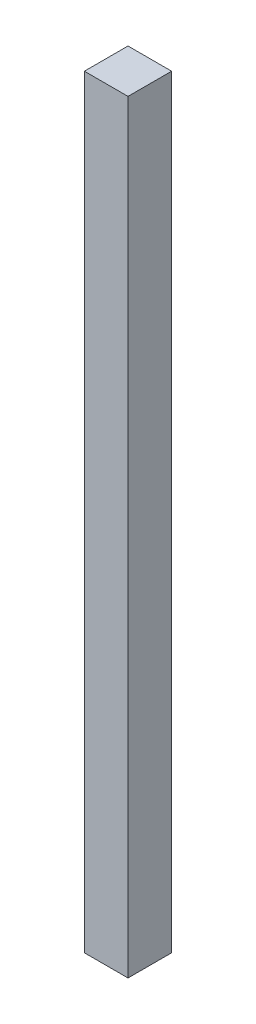
ISO-10303-21;
HEADER;
FILE_DESCRIPTION(('STEP AP214'),'2;1');
FILE_NAME('part.step','',(''),(''),'','','');
FILE_SCHEMA(('AUTOMOTIVE_DESIGN { 1 0 10303 214 1 1 1 1 }'));
ENDSEC;
DATA;
#1=APPLICATION_CONTEXT('core data for automotive mechanical design processes');
#2=APPLICATION_PROTOCOL_DEFINITION('international standard','automotive_design',2000,#1);
#3=PRODUCT_CONTEXT('',#1,'mechanical');
#4=PRODUCT('Part','Part','',(#3));
#5=PRODUCT_RELATED_PRODUCT_CATEGORY('part','',(#4));
#6=PRODUCT_DEFINITION_FORMATION('','',#4);
#7=PRODUCT_DEFINITION_CONTEXT('part definition',#1,'design');
#8=PRODUCT_DEFINITION('design','',#6,#7);
#9=PRODUCT_DEFINITION_SHAPE('','',#8);
#10=(LENGTH_UNIT() NAMED_UNIT(*) SI_UNIT(.MILLI.,.METRE.));
#11=(NAMED_UNIT(*) PLANE_ANGLE_UNIT() SI_UNIT($,.RADIAN.));
#12=(NAMED_UNIT(*) SI_UNIT($,.STERADIAN.) SOLID_ANGLE_UNIT());
#13=UNCERTAINTY_MEASURE_WITH_UNIT(LENGTH_MEASURE(1.E-05),#10,'distance_accuracy_value','');
#14=(GEOMETRIC_REPRESENTATION_CONTEXT(3) GLOBAL_UNCERTAINTY_ASSIGNED_CONTEXT((#13)) GLOBAL_UNIT_ASSIGNED_CONTEXT((#10,
#11,#12)) REPRESENTATION_CONTEXT('',''));
#15=CARTESIAN_POINT('',(0.,0.,0.));
#16=DIRECTION('',(0.,0.,1.));
#17=DIRECTION('',(1.,0.,0.));
#18=AXIS2_PLACEMENT_3D('',#15,#16,#17);
#19=CARTESIAN_POINT('',(0.,350.,0.));
#20=DIRECTION('',(1.,0.,0.));
#21=DIRECTION('',(0.,0.,-1.));
#22=AXIS2_PLACEMENT_3D('',#19,#20,#21);
#23=PLANE('',#22);
#24=DIRECTION('',(0.,0.,1.));
#25=VECTOR('',#24,1.);
#26=CARTESIAN_POINT('',(0.,0.,0.));
#27=LINE('',#26,#25);
#28=CARTESIAN_POINT('',(0.,0.,0.));
#29=VERTEX_POINT('',#28);
#30=CARTESIAN_POINT('',(0.,0.,20.));
#31=VERTEX_POINT('',#30);
#32=EDGE_CURVE('E104',#29,#31,#27,.T.);
#33=ORIENTED_EDGE('',*,*,#32,.T.);
#34=DIRECTION('',(0.,-1.,0.));
#35=VECTOR('',#34,1.);
#36=CARTESIAN_POINT('',(0.,350.,20.));
#37=LINE('',#36,#35);
#38=CARTESIAN_POINT('',(0.,350.,20.));
#39=VERTEX_POINT('',#38);
#40=EDGE_CURVE('E11',#39,#31,#37,.T.);
#41=ORIENTED_EDGE('',*,*,#40,.F.);
#42=DIRECTION('',(0.,0.,1.));
#43=VECTOR('',#42,1.);
#44=CARTESIAN_POINT('',(0.,350.,0.));
#45=LINE('',#44,#43);
#46=CARTESIAN_POINT('',(0.,350.,0.));
#47=VERTEX_POINT('',#46);
#48=EDGE_CURVE('E92',#47,#39,#45,.T.);
#49=ORIENTED_EDGE('',*,*,#48,.F.);
#50=DIRECTION('',(0.,-1.,0.));
#51=VECTOR('',#50,1.);
#52=CARTESIAN_POINT('',(0.,350.,0.));
#53=LINE('',#52,#51);
#54=EDGE_CURVE('E100',#47,#29,#53,.T.);
#55=ORIENTED_EDGE('',*,*,#54,.T.);
#56=EDGE_LOOP('',(#33,#41,#49,#55));
#57=FACE_BOUND('',#56,.T.);
#58=ADVANCED_FACE('F41',(#57),#23,.F.);
#59=CARTESIAN_POINT('',(0.,350.,20.));
#60=DIRECTION('',(0.,0.,-1.));
#61=DIRECTION('',(-1.,0.,0.));
#62=AXIS2_PLACEMENT_3D('',#59,#60,#61);
#63=PLANE('',#62);
#64=DIRECTION('',(1.,0.,0.));
#65=VECTOR('',#64,1.);
#66=CARTESIAN_POINT('',(0.,0.,20.));
#67=LINE('',#66,#65);
#68=CARTESIAN_POINT('',(20.,0.,20.));
#69=VERTEX_POINT('',#68);
#70=EDGE_CURVE('E96',#31,#69,#67,.T.);
#71=ORIENTED_EDGE('',*,*,#70,.T.);
#72=DIRECTION('',(0.,-1.,0.));
#73=VECTOR('',#72,1.);
#74=CARTESIAN_POINT('',(20.,350.,20.));
#75=LINE('',#74,#73);
#76=CARTESIAN_POINT('',(20.,350.,20.));
#77=VERTEX_POINT('',#76);
#78=EDGE_CURVE('E49',#77,#69,#75,.T.);
#79=ORIENTED_EDGE('',*,*,#78,.F.);
#80=DIRECTION('',(1.,0.,0.));
#81=VECTOR('',#80,1.);
#82=CARTESIAN_POINT('',(0.,350.,20.));
#83=LINE('',#82,#81);
#84=EDGE_CURVE('E87',#39,#77,#83,.T.);
#85=ORIENTED_EDGE('',*,*,#84,.F.);
#86=ORIENTED_EDGE('',*,*,#40,.T.);
#87=EDGE_LOOP('',(#71,#79,#85,#86));
#88=FACE_BOUND('',#87,.T.);
#89=ADVANCED_FACE('F95',(#88),#63,.F.);
#90=CARTESIAN_POINT('',(20.,350.,0.));
#91=DIRECTION('',(-1.,0.,0.));
#92=DIRECTION('',(0.,0.,1.));
#93=AXIS2_PLACEMENT_3D('',#90,#91,#92);
#94=PLANE('',#93);
#95=DIRECTION('',(0.,0.,-1.));
#96=VECTOR('',#95,1.);
#97=CARTESIAN_POINT('',(20.,0.,0.));
#98=LINE('',#97,#96);
#99=CARTESIAN_POINT('',(20.,0.,0.));
#100=VERTEX_POINT('',#99);
#101=EDGE_CURVE('E74',#69,#100,#98,.T.);
#102=ORIENTED_EDGE('',*,*,#101,.T.);
#103=DIRECTION('',(0.,-1.,0.));
#104=VECTOR('',#103,1.);
#105=CARTESIAN_POINT('',(20.,350.,0.));
#106=LINE('',#105,#104);
#107=CARTESIAN_POINT('',(20.,350.,0.));
#108=VERTEX_POINT('',#107);
#109=EDGE_CURVE('E97',#108,#100,#106,.T.);
#110=ORIENTED_EDGE('',*,*,#109,.F.);
#111=DIRECTION('',(0.,0.,-1.));
#112=VECTOR('',#111,1.);
#113=CARTESIAN_POINT('',(20.,350.,0.));
#114=LINE('',#113,#112);
#115=EDGE_CURVE('E90',#77,#108,#114,.T.);
#116=ORIENTED_EDGE('',*,*,#115,.F.);
#117=ORIENTED_EDGE('',*,*,#78,.T.);
#118=EDGE_LOOP('',(#102,#110,#116,#117));
#119=FACE_BOUND('',#118,.T.);
#120=ADVANCED_FACE('F98',(#119),#94,.F.);
#121=CARTESIAN_POINT('',(0.,350.,0.));
#122=DIRECTION('',(0.,0.,1.));
#123=DIRECTION('',(1.,0.,0.));
#124=AXIS2_PLACEMENT_3D('',#121,#122,#123);
#125=PLANE('',#124);
#126=DIRECTION('',(-1.,0.,0.));
#127=VECTOR('',#126,1.);
#128=CARTESIAN_POINT('',(0.,0.,0.));
#129=LINE('',#128,#127);
#130=EDGE_CURVE('E80',#100,#29,#129,.T.);
#131=ORIENTED_EDGE('',*,*,#130,.T.);
#132=ORIENTED_EDGE('',*,*,#54,.F.);
#133=DIRECTION('',(-1.,0.,0.));
#134=VECTOR('',#133,1.);
#135=CARTESIAN_POINT('',(0.,350.,0.));
#136=LINE('',#135,#134);
#137=EDGE_CURVE('E57',#108,#47,#136,.T.);
#138=ORIENTED_EDGE('',*,*,#137,.F.);
#139=ORIENTED_EDGE('',*,*,#109,.T.);
#140=EDGE_LOOP('',(#131,#132,#138,#139));
#141=FACE_BOUND('',#140,.T.);
#142=ADVANCED_FACE('F111',(#141),#125,.F.);
#143=CARTESIAN_POINT('',(0.,350.,0.));
#144=DIRECTION('',(0.,1.,0.));
#145=DIRECTION('',(0.,0.,1.));
#146=AXIS2_PLACEMENT_3D('',#143,#144,#145);
#147=PLANE('',#146);
#148=ORIENTED_EDGE('',*,*,#48,.T.);
#149=ORIENTED_EDGE('',*,*,#84,.T.);
#150=ORIENTED_EDGE('',*,*,#115,.T.);
#151=ORIENTED_EDGE('',*,*,#137,.T.);
#152=EDGE_LOOP('',(#148,#149,#150,#151));
#153=FACE_BOUND('',#152,.T.);
#154=ADVANCED_FACE('F88',(#153),#147,.T.);
#155=CARTESIAN_POINT('',(0.,0.,0.));
#156=DIRECTION('',(0.,1.,0.));
#157=DIRECTION('',(0.,0.,1.));
#158=AXIS2_PLACEMENT_3D('',#155,#156,#157);
#159=PLANE('',#158);
#160=ORIENTED_EDGE('',*,*,#32,.F.);
#161=ORIENTED_EDGE('',*,*,#130,.F.);
#162=ORIENTED_EDGE('',*,*,#101,.F.);
#163=ORIENTED_EDGE('',*,*,#70,.F.);
#164=EDGE_LOOP('',(#160,#161,#162,#163));
#165=FACE_BOUND('',#164,.T.);
#166=ADVANCED_FACE('F114',(#165),#159,.F.);
#167=CLOSED_SHELL('',(#58,#89,#120,#142,#154,#166));
#168=MANIFOLD_SOLID_BREP('B2',#167);
#169=ADVANCED_BREP_SHAPE_REPRESENTATION('',(#18,#168),#14);
#170=SHAPE_DEFINITION_REPRESENTATION(#9,#169);
ENDSEC;
END-ISO-10303-21;
